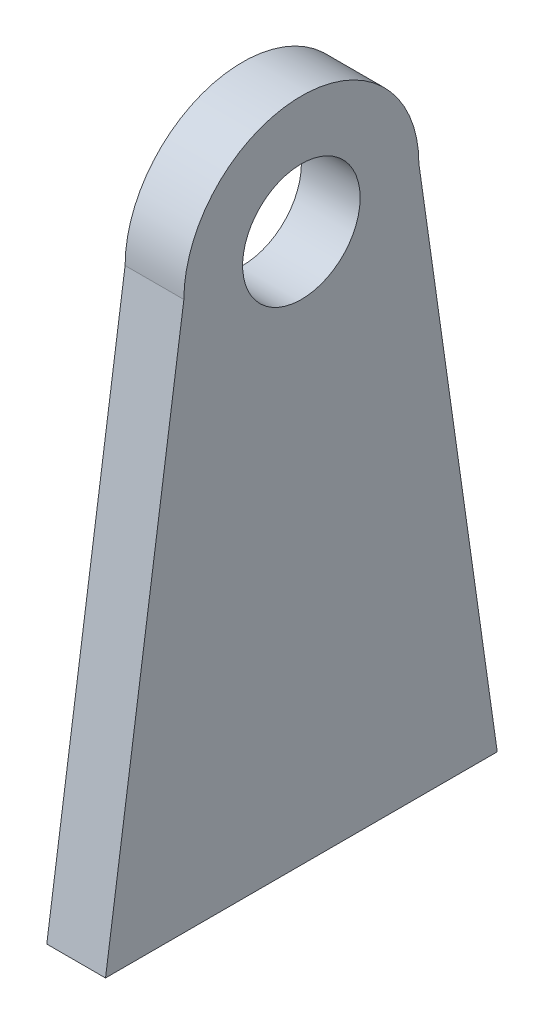
ISO-10303-21;
HEADER;
FILE_DESCRIPTION(('STEP AP214'),'2;1');
FILE_NAME('part.step','',(''),(''),'','','');
FILE_SCHEMA(('AUTOMOTIVE_DESIGN { 1 0 10303 214 1 1 1 1 }'));
ENDSEC;
DATA;
#1=APPLICATION_CONTEXT('core data for automotive mechanical design processes');
#2=APPLICATION_PROTOCOL_DEFINITION('international standard','automotive_design',2000,#1);
#3=PRODUCT_CONTEXT('',#1,'mechanical');
#4=PRODUCT('Part','Part','',(#3));
#5=PRODUCT_RELATED_PRODUCT_CATEGORY('part','',(#4));
#6=PRODUCT_DEFINITION_FORMATION('','',#4);
#7=PRODUCT_DEFINITION_CONTEXT('part definition',#1,'design');
#8=PRODUCT_DEFINITION('design','',#6,#7);
#9=PRODUCT_DEFINITION_SHAPE('','',#8);
#10=(LENGTH_UNIT() NAMED_UNIT(*) SI_UNIT(.MILLI.,.METRE.));
#11=(NAMED_UNIT(*) PLANE_ANGLE_UNIT() SI_UNIT($,.RADIAN.));
#12=(NAMED_UNIT(*) SI_UNIT($,.STERADIAN.) SOLID_ANGLE_UNIT());
#13=UNCERTAINTY_MEASURE_WITH_UNIT(LENGTH_MEASURE(1.E-05),#10,'distance_accuracy_value','');
#14=(GEOMETRIC_REPRESENTATION_CONTEXT(3) GLOBAL_UNCERTAINTY_ASSIGNED_CONTEXT((#13)) GLOBAL_UNIT_ASSIGNED_CONTEXT((#10,
#11,#12)) REPRESENTATION_CONTEXT('',''));
#15=CARTESIAN_POINT('',(0.,0.,0.));
#16=DIRECTION('',(0.,0.,1.));
#17=DIRECTION('',(1.,0.,0.));
#18=AXIS2_PLACEMENT_3D('',#15,#16,#17);
#19=CARTESIAN_POINT('',(6.,56.,-20.));
#20=DIRECTION('',(1.,0.,0.));
#21=DIRECTION('',(0.,0.,-1.));
#22=AXIS2_PLACEMENT_3D('',#19,#20,#21);
#23=PLANE('',#22);
#24=DIRECTION('',(0.,-0.989949493661167,0.14142135623731));
#25=VECTOR('',#24,1.);
#26=CARTESIAN_POINT('',(6.,0.,0.));
#27=LINE('',#26,#25);
#28=CARTESIAN_POINT('',(6.,56.,-8.));
#29=VERTEX_POINT('',#28);
#30=CARTESIAN_POINT('',(6.,0.,0.));
#31=VERTEX_POINT('',#30);
#32=EDGE_CURVE('E98',#29,#31,#27,.T.);
#33=ORIENTED_EDGE('',*,*,#32,.T.);
#34=DIRECTION('',(0.,0.,-1.));
#35=VECTOR('',#34,1.);
#36=CARTESIAN_POINT('',(6.,0.,0.));
#37=LINE('',#36,#35);
#38=CARTESIAN_POINT('',(6.,0.,-40.));
#39=VERTEX_POINT('',#38);
#40=EDGE_CURVE('E93',#31,#39,#37,.T.);
#41=ORIENTED_EDGE('',*,*,#40,.T.);
#42=DIRECTION('',(0.,0.989949493661167,0.14142135623731));
#43=VECTOR('',#42,1.);
#44=CARTESIAN_POINT('',(6.,0.,-40.));
#45=LINE('',#44,#43);
#46=CARTESIAN_POINT('',(6.,56.,-32.));
#47=VERTEX_POINT('',#46);
#48=EDGE_CURVE('E96',#39,#47,#45,.T.);
#49=ORIENTED_EDGE('',*,*,#48,.T.);
#50=CARTESIAN_POINT('',(6.,56.,-20.));
#51=DIRECTION('',(1.,0.,0.));
#52=DIRECTION('',(0.,0.,-1.));
#53=AXIS2_PLACEMENT_3D('',#50,#51,#52);
#54=CIRCLE('',#53,12.);
#55=EDGE_CURVE('E63',#47,#29,#54,.T.);
#56=ORIENTED_EDGE('',*,*,#55,.T.);
#57=EDGE_LOOP('',(#33,#41,#49,#56));
#58=FACE_BOUND('',#57,.T.);
#59=CARTESIAN_POINT('',(6.,56.,-20.));
#60=DIRECTION('',(1.,0.,0.));
#61=DIRECTION('',(0.,0.,-1.));
#62=AXIS2_PLACEMENT_3D('',#59,#60,#61);
#63=CIRCLE('',#62,6.);
#64=CARTESIAN_POINT('',(6.,56.,-26.));
#65=VERTEX_POINT('',#64);
#66=EDGE_CURVE('E118',#65,#65,#63,.T.);
#67=ORIENTED_EDGE('',*,*,#66,.F.);
#68=EDGE_LOOP('',(#67));
#69=FACE_BOUND('',#68,.T.);
#70=ADVANCED_FACE('F45',(#58,#69),#23,.T.);
#71=CARTESIAN_POINT('',(0.,56.,-20.));
#72=DIRECTION('',(1.,0.,0.));
#73=DIRECTION('',(0.,0.,-1.));
#74=AXIS2_PLACEMENT_3D('',#71,#72,#73);
#75=PLANE('',#74);
#76=DIRECTION('',(0.,-0.989949493661167,0.14142135623731));
#77=VECTOR('',#76,1.);
#78=CARTESIAN_POINT('',(0.,0.,0.));
#79=LINE('',#78,#77);
#80=CARTESIAN_POINT('',(0.,56.,-8.));
#81=VERTEX_POINT('',#80);
#82=CARTESIAN_POINT('',(0.,0.,0.));
#83=VERTEX_POINT('',#82);
#84=EDGE_CURVE('E114',#81,#83,#79,.T.);
#85=ORIENTED_EDGE('',*,*,#84,.F.);
#86=CARTESIAN_POINT('',(0.,56.,-20.));
#87=DIRECTION('',(1.,0.,0.));
#88=DIRECTION('',(0.,0.,-1.));
#89=AXIS2_PLACEMENT_3D('',#86,#87,#88);
#90=CIRCLE('',#89,12.);
#91=CARTESIAN_POINT('',(0.,56.,-32.));
#92=VERTEX_POINT('',#91);
#93=EDGE_CURVE('E86',#92,#81,#90,.T.);
#94=ORIENTED_EDGE('',*,*,#93,.F.);
#95=DIRECTION('',(0.,0.989949493661167,0.14142135623731));
#96=VECTOR('',#95,1.);
#97=CARTESIAN_POINT('',(0.,0.,-40.));
#98=LINE('',#97,#96);
#99=CARTESIAN_POINT('',(0.,0.,-40.));
#100=VERTEX_POINT('',#99);
#101=EDGE_CURVE('E80',#100,#92,#98,.T.);
#102=ORIENTED_EDGE('',*,*,#101,.F.);
#103=DIRECTION('',(0.,0.,-1.));
#104=VECTOR('',#103,1.);
#105=CARTESIAN_POINT('',(0.,0.,0.));
#106=LINE('',#105,#104);
#107=EDGE_CURVE('E103',#83,#100,#106,.T.);
#108=ORIENTED_EDGE('',*,*,#107,.F.);
#109=EDGE_LOOP('',(#85,#94,#102,#108));
#110=FACE_BOUND('',#109,.T.);
#111=CARTESIAN_POINT('',(0.,56.,-20.));
#112=DIRECTION('',(1.,0.,0.));
#113=DIRECTION('',(0.,0.,-1.));
#114=AXIS2_PLACEMENT_3D('',#111,#112,#113);
#115=CIRCLE('',#114,6.);
#116=CARTESIAN_POINT('',(0.,56.,-26.));
#117=VERTEX_POINT('',#116);
#118=EDGE_CURVE('E136',#117,#117,#115,.T.);
#119=ORIENTED_EDGE('',*,*,#118,.T.);
#120=EDGE_LOOP('',(#119));
#121=FACE_BOUND('',#120,.T.);
#122=ADVANCED_FACE('F131',(#110,#121),#75,.F.);
#123=CARTESIAN_POINT('',(6.,0.,0.));
#124=DIRECTION('',(0.,-0.14142135623731,-0.989949493661167));
#125=DIRECTION('',(0.,0.989949493661167,-0.14142135623731));
#126=AXIS2_PLACEMENT_3D('',#123,#124,#125);
#127=PLANE('',#126);
#128=ORIENTED_EDGE('',*,*,#84,.T.);
#129=DIRECTION('',(-1.,0.,0.));
#130=VECTOR('',#129,1.);
#131=CARTESIAN_POINT('',(6.,0.,0.));
#132=LINE('',#131,#130);
#133=EDGE_CURVE('E11',#31,#83,#132,.T.);
#134=ORIENTED_EDGE('',*,*,#133,.F.);
#135=ORIENTED_EDGE('',*,*,#32,.F.);
#136=DIRECTION('',(-1.,0.,0.));
#137=VECTOR('',#136,1.);
#138=CARTESIAN_POINT('',(6.,56.,-8.));
#139=LINE('',#138,#137);
#140=EDGE_CURVE('E110',#29,#81,#139,.T.);
#141=ORIENTED_EDGE('',*,*,#140,.T.);
#142=EDGE_LOOP('',(#128,#134,#135,#141));
#143=FACE_BOUND('',#142,.T.);
#144=ADVANCED_FACE('F47',(#143),#127,.F.);
#145=CARTESIAN_POINT('',(6.,0.,0.));
#146=DIRECTION('',(0.,1.,0.));
#147=DIRECTION('',(0.,0.,1.));
#148=AXIS2_PLACEMENT_3D('',#145,#146,#147);
#149=PLANE('',#148);
#150=ORIENTED_EDGE('',*,*,#107,.T.);
#151=DIRECTION('',(-1.,0.,0.));
#152=VECTOR('',#151,1.);
#153=CARTESIAN_POINT('',(6.,0.,-40.));
#154=LINE('',#153,#152);
#155=EDGE_CURVE('E55',#39,#100,#154,.T.);
#156=ORIENTED_EDGE('',*,*,#155,.F.);
#157=ORIENTED_EDGE('',*,*,#40,.F.);
#158=ORIENTED_EDGE('',*,*,#133,.T.);
#159=EDGE_LOOP('',(#150,#156,#157,#158));
#160=FACE_BOUND('',#159,.T.);
#161=ADVANCED_FACE('F102',(#160),#149,.F.);
#162=CARTESIAN_POINT('',(6.,0.,-40.));
#163=DIRECTION('',(0.,-0.14142135623731,0.989949493661167));
#164=DIRECTION('',(0.,-0.989949493661167,-0.14142135623731));
#165=AXIS2_PLACEMENT_3D('',#162,#163,#164);
#166=PLANE('',#165);
#167=ORIENTED_EDGE('',*,*,#101,.T.);
#168=DIRECTION('',(-1.,0.,0.));
#169=VECTOR('',#168,1.);
#170=CARTESIAN_POINT('',(6.,56.,-32.));
#171=LINE('',#170,#169);
#172=EDGE_CURVE('E105',#47,#92,#171,.T.);
#173=ORIENTED_EDGE('',*,*,#172,.F.);
#174=ORIENTED_EDGE('',*,*,#48,.F.);
#175=ORIENTED_EDGE('',*,*,#155,.T.);
#176=EDGE_LOOP('',(#167,#173,#174,#175));
#177=FACE_BOUND('',#176,.T.);
#178=ADVANCED_FACE('F106',(#177),#166,.F.);
#179=CARTESIAN_POINT('',(6.,56.,-20.));
#180=DIRECTION('',(-1.,0.,0.));
#181=DIRECTION('',(0.,0.,1.));
#182=AXIS2_PLACEMENT_3D('',#179,#180,#181);
#183=CYLINDRICAL_SURFACE('',#182,12.);
#184=ORIENTED_EDGE('',*,*,#93,.T.);
#185=ORIENTED_EDGE('',*,*,#140,.F.);
#186=ORIENTED_EDGE('',*,*,#55,.F.);
#187=ORIENTED_EDGE('',*,*,#172,.T.);
#188=EDGE_LOOP('',(#184,#185,#186,#187));
#189=FACE_BOUND('',#188,.T.);
#190=ADVANCED_FACE('F128',(#189),#183,.T.);
#191=CARTESIAN_POINT('',(6.,56.,-20.));
#192=DIRECTION('',(-1.,0.,0.));
#193=DIRECTION('',(0.,0.,1.));
#194=AXIS2_PLACEMENT_3D('',#191,#192,#193);
#195=CYLINDRICAL_SURFACE('',#194,6.);
#196=ORIENTED_EDGE('',*,*,#66,.T.);
#197=EDGE_LOOP('',(#196));
#198=FACE_BOUND('',#197,.T.);
#199=ORIENTED_EDGE('',*,*,#118,.F.);
#200=EDGE_LOOP('',(#199));
#201=FACE_BOUND('',#200,.T.);
#202=ADVANCED_FACE('F144',(#198,#201),#195,.F.);
#203=CLOSED_SHELL('',(#70,#122,#144,#161,#178,#190,#202));
#204=MANIFOLD_SOLID_BREP('B2',#203);
#205=ADVANCED_BREP_SHAPE_REPRESENTATION('',(#18,#204),#14);
#206=SHAPE_DEFINITION_REPRESENTATION(#9,#205);
ENDSEC;
END-ISO-10303-21;
